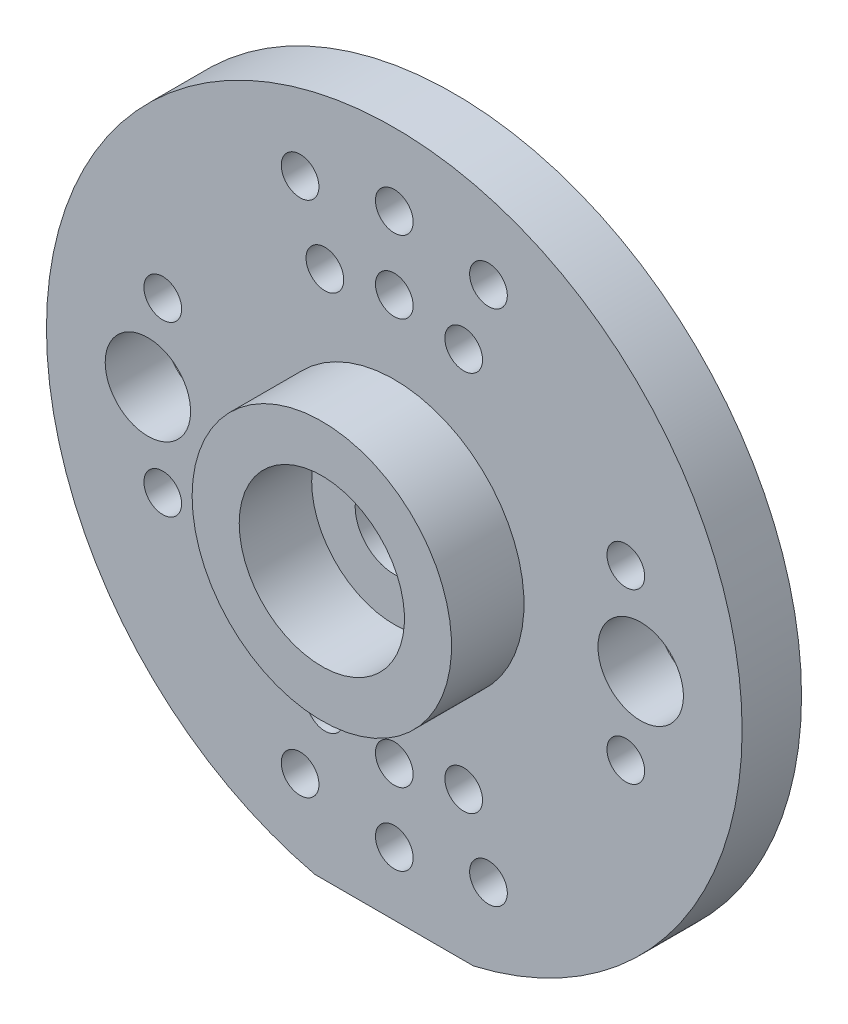
ISO-10303-21;
HEADER;
FILE_DESCRIPTION(('STEP AP214'),'2;1');
FILE_NAME('part.step','',(''),(''),'','','');
FILE_SCHEMA(('AUTOMOTIVE_DESIGN { 1 0 10303 214 1 1 1 1 }'));
ENDSEC;
DATA;
#1=APPLICATION_CONTEXT('core data for automotive mechanical design processes');
#2=APPLICATION_PROTOCOL_DEFINITION('international standard','automotive_design',2000,#1);
#3=PRODUCT_CONTEXT('',#1,'mechanical');
#4=PRODUCT('Part','Part','',(#3));
#5=PRODUCT_RELATED_PRODUCT_CATEGORY('part','',(#4));
#6=PRODUCT_DEFINITION_FORMATION('','',#4);
#7=PRODUCT_DEFINITION_CONTEXT('part definition',#1,'design');
#8=PRODUCT_DEFINITION('design','',#6,#7);
#9=PRODUCT_DEFINITION_SHAPE('','',#8);
#10=(LENGTH_UNIT() NAMED_UNIT(*) SI_UNIT(.MILLI.,.METRE.));
#11=(NAMED_UNIT(*) PLANE_ANGLE_UNIT() SI_UNIT($,.RADIAN.));
#12=(NAMED_UNIT(*) SI_UNIT($,.STERADIAN.) SOLID_ANGLE_UNIT());
#13=UNCERTAINTY_MEASURE_WITH_UNIT(LENGTH_MEASURE(1.E-05),#10,'distance_accuracy_value','');
#14=(GEOMETRIC_REPRESENTATION_CONTEXT(3) GLOBAL_UNCERTAINTY_ASSIGNED_CONTEXT((#13)) GLOBAL_UNIT_ASSIGNED_CONTEXT((#10,
#11,#12)) REPRESENTATION_CONTEXT('',''));
#15=CARTESIAN_POINT('',(0.,0.,0.));
#16=DIRECTION('',(0.,0.,1.));
#17=DIRECTION('',(1.,0.,0.));
#18=AXIS2_PLACEMENT_3D('',#15,#16,#17);
#19=CARTESIAN_POINT('',(0.,0.,2.05));
#20=DIRECTION('',(0.,0.,-1.));
#21=DIRECTION('',(-1.,0.,0.));
#22=AXIS2_PLACEMENT_3D('',#19,#20,#21);
#23=PLANE('',#22);
#24=CARTESIAN_POINT('',(0.,0.,2.05));
#25=DIRECTION('',(0.,0.,-1.));
#26=DIRECTION('',(-1.,0.,0.));
#27=AXIS2_PLACEMENT_3D('',#24,#25,#26);
#28=CIRCLE('',#27,1.35);
#29=CARTESIAN_POINT('',(-1.35,0.,2.05));
#30=VERTEX_POINT('',#29);
#31=EDGE_CURVE('E19',#30,#30,#28,.T.);
#32=ORIENTED_EDGE('',*,*,#31,.T.);
#33=EDGE_LOOP('',(#32));
#34=FACE_BOUND('',#33,.T.);
#35=CARTESIAN_POINT('',(0.,0.,2.05));
#36=DIRECTION('',(0.,0.,-1.));
#37=DIRECTION('',(-1.,0.,0.));
#38=AXIS2_PLACEMENT_3D('',#35,#36,#37);
#39=CIRCLE('',#38,2.85);
#40=CARTESIAN_POINT('',(-2.85,0.,2.05));
#41=VERTEX_POINT('',#40);
#42=EDGE_CURVE('E190',#41,#41,#39,.F.);
#43=ORIENTED_EDGE('',*,*,#42,.T.);
#44=EDGE_LOOP('',(#43));
#45=FACE_BOUND('',#44,.T.);
#46=ADVANCED_FACE('F16',(#34,#45),#23,.F.);
#47=CARTESIAN_POINT('',(0.,0.,0.));
#48=DIRECTION('',(0.,0.,-1.));
#49=DIRECTION('',(-1.,0.,0.));
#50=AXIS2_PLACEMENT_3D('',#47,#48,#49);
#51=CYLINDRICAL_SURFACE('',#50,1.35);
#52=CARTESIAN_POINT('',(0.,0.,0.));
#53=DIRECTION('',(0.,0.,-1.));
#54=DIRECTION('',(-1.,0.,0.));
#55=AXIS2_PLACEMENT_3D('',#52,#53,#54);
#56=CIRCLE('',#55,1.35);
#57=CARTESIAN_POINT('',(-1.35,0.,0.));
#58=VERTEX_POINT('',#57);
#59=EDGE_CURVE('E188',#58,#58,#56,.F.);
#60=ORIENTED_EDGE('',*,*,#59,.F.);
#61=EDGE_LOOP('',(#60));
#62=FACE_BOUND('',#61,.T.);
#63=ORIENTED_EDGE('',*,*,#31,.F.);
#64=EDGE_LOOP('',(#63));
#65=FACE_BOUND('',#64,.T.);
#66=ADVANCED_FACE('F198',(#62,#65),#51,.F.);
#67=CARTESIAN_POINT('',(0.,0.,2.05));
#68=DIRECTION('',(0.,0.,-1.));
#69=DIRECTION('',(-1.,0.,0.));
#70=AXIS2_PLACEMENT_3D('',#67,#68,#69);
#71=CYLINDRICAL_SURFACE('',#70,2.85);
#72=CARTESIAN_POINT('',(0.,0.,4.55));
#73=DIRECTION('',(0.,0.,-1.));
#74=DIRECTION('',(-1.,0.,0.));
#75=AXIS2_PLACEMENT_3D('',#72,#73,#74);
#76=CIRCLE('',#75,2.85);
#77=CARTESIAN_POINT('',(-2.85,0.,4.55));
#78=VERTEX_POINT('',#77);
#79=EDGE_CURVE('E185',#78,#78,#76,.F.);
#80=ORIENTED_EDGE('',*,*,#79,.T.);
#81=EDGE_LOOP('',(#80));
#82=FACE_BOUND('',#81,.T.);
#83=ORIENTED_EDGE('',*,*,#42,.F.);
#84=EDGE_LOOP('',(#83));
#85=FACE_BOUND('',#84,.T.);
#86=ADVANCED_FACE('F200',(#82,#85),#71,.F.);
#87=CARTESIAN_POINT('',(0.,0.,0.));
#88=DIRECTION('',(0.,0.,-1.));
#89=DIRECTION('',(-1.,0.,0.));
#90=AXIS2_PLACEMENT_3D('',#87,#88,#89);
#91=PLANE('',#90);
#92=ORIENTED_EDGE('',*,*,#59,.T.);
#93=EDGE_LOOP('',(#92));
#94=FACE_BOUND('',#93,.T.);
#95=CARTESIAN_POINT('',(0.,0.,0.));
#96=DIRECTION('',(0.,0.,1.));
#97=DIRECTION('',(1.,0.,0.));
#98=AXIS2_PLACEMENT_3D('',#95,#96,#97);
#99=CIRCLE('',#98,3.);
#100=CARTESIAN_POINT('',(3.,0.,0.));
#101=VERTEX_POINT('',#100);
#102=EDGE_CURVE('E182',#101,#101,#99,.F.);
#103=ORIENTED_EDGE('',*,*,#102,.T.);
#104=EDGE_LOOP('',(#103));
#105=FACE_BOUND('',#104,.T.);
#106=ADVANCED_FACE('F207',(#94,#105),#91,.T.);
#107=CARTESIAN_POINT('',(0.,0.,4.55));
#108=DIRECTION('',(0.,0.,-1.));
#109=DIRECTION('',(-1.,0.,0.));
#110=AXIS2_PLACEMENT_3D('',#107,#108,#109);
#111=PLANE('',#110);
#112=ORIENTED_EDGE('',*,*,#79,.F.);
#113=EDGE_LOOP('',(#112));
#114=FACE_BOUND('',#113,.T.);
#115=CARTESIAN_POINT('',(0.,0.,4.55));
#116=DIRECTION('',(0.,0.,-1.));
#117=DIRECTION('',(-1.,0.,0.));
#118=AXIS2_PLACEMENT_3D('',#115,#116,#117);
#119=CIRCLE('',#118,4.475);
#120=CARTESIAN_POINT('',(-4.475,0.,4.55));
#121=VERTEX_POINT('',#120);
#122=EDGE_CURVE('E179',#121,#121,#119,.T.);
#123=ORIENTED_EDGE('',*,*,#122,.F.);
#124=EDGE_LOOP('',(#123));
#125=FACE_BOUND('',#124,.T.);
#126=ADVANCED_FACE('F312',(#114,#125),#111,.F.);
#127=CARTESIAN_POINT('',(0.,0.,0.));
#128=DIRECTION('',(0.,0.,1.));
#129=DIRECTION('',(1.,0.,0.));
#130=AXIS2_PLACEMENT_3D('',#127,#128,#129);
#131=CYLINDRICAL_SURFACE('',#130,3.);
#132=CARTESIAN_POINT('',(0.,0.,-0.5));
#133=DIRECTION('',(0.,0.,1.));
#134=DIRECTION('',(1.,0.,0.));
#135=AXIS2_PLACEMENT_3D('',#132,#133,#134);
#136=CIRCLE('',#135,3.);
#137=CARTESIAN_POINT('',(3.,0.,-0.5));
#138=VERTEX_POINT('',#137);
#139=EDGE_CURVE('E176',#138,#138,#136,.F.);
#140=ORIENTED_EDGE('',*,*,#139,.T.);
#141=EDGE_LOOP('',(#140));
#142=FACE_BOUND('',#141,.T.);
#143=ORIENTED_EDGE('',*,*,#102,.F.);
#144=EDGE_LOOP('',(#143));
#145=FACE_BOUND('',#144,.T.);
#146=ADVANCED_FACE('F308',(#142,#145),#131,.F.);
#147=CARTESIAN_POINT('',(0.,0.,2.05));
#148=DIRECTION('',(0.,0.,-1.));
#149=DIRECTION('',(-1.,0.,0.));
#150=AXIS2_PLACEMENT_3D('',#147,#148,#149);
#151=CYLINDRICAL_SURFACE('',#150,4.475);
#152=CARTESIAN_POINT('',(0.,0.,2.05));
#153=DIRECTION('',(0.,0.,-1.));
#154=DIRECTION('',(-1.,0.,0.));
#155=AXIS2_PLACEMENT_3D('',#152,#153,#154);
#156=CIRCLE('',#155,4.475);
#157=CARTESIAN_POINT('',(-4.475,0.,2.05));
#158=VERTEX_POINT('',#157);
#159=EDGE_CURVE('E173',#158,#158,#156,.F.);
#160=ORIENTED_EDGE('',*,*,#159,.T.);
#161=EDGE_LOOP('',(#160));
#162=FACE_BOUND('',#161,.T.);
#163=ORIENTED_EDGE('',*,*,#122,.T.);
#164=EDGE_LOOP('',(#163));
#165=FACE_BOUND('',#164,.T.);
#166=ADVANCED_FACE('F304',(#162,#165),#151,.T.);
#167=CARTESIAN_POINT('',(0.,0.,-0.5));
#168=DIRECTION('',(0.,0.,1.));
#169=DIRECTION('',(1.,0.,0.));
#170=AXIS2_PLACEMENT_3D('',#167,#168,#169);
#171=PLANE('',#170);
#172=ORIENTED_EDGE('',*,*,#139,.F.);
#173=EDGE_LOOP('',(#172));
#174=FACE_BOUND('',#173,.T.);
#175=CARTESIAN_POINT('',(0.,0.,-0.5));
#176=DIRECTION('',(0.,0.,1.));
#177=DIRECTION('',(1.,0.,0.));
#178=AXIS2_PLACEMENT_3D('',#175,#176,#177);
#179=CIRCLE('',#178,3.75);
#180=CARTESIAN_POINT('',(3.75,0.,-0.5));
#181=VERTEX_POINT('',#180);
#182=EDGE_CURVE('E167',#181,#181,#179,.T.);
#183=ORIENTED_EDGE('',*,*,#182,.F.);
#184=EDGE_LOOP('',(#183));
#185=FACE_BOUND('',#184,.T.);
#186=ADVANCED_FACE('F301',(#174,#185),#171,.F.);
#187=CARTESIAN_POINT('',(0.,0.,2.05));
#188=DIRECTION('',(0.,0.,-1.));
#189=DIRECTION('',(-1.,0.,0.));
#190=AXIS2_PLACEMENT_3D('',#187,#188,#189);
#191=PLANE('',#190);
#192=DIRECTION('',(1.,0.,0.));
#193=VECTOR('',#192,1.);
#194=CARTESIAN_POINT('',(-6.35,-11.684,2.05));
#195=LINE('',#194,#193);
#196=CARTESIAN_POINT('',(2.73571635956655,-11.684,2.05));
#197=VERTEX_POINT('',#196);
#198=CARTESIAN_POINT('',(-2.73571635956654,-11.684,2.05));
#199=VERTEX_POINT('',#198);
#200=EDGE_CURVE('E50',#197,#199,#195,.F.);
#201=ORIENTED_EDGE('',*,*,#200,.F.);
#202=CARTESIAN_POINT('',(0.,0.,2.05));
#203=DIRECTION('',(0.,0.,-1.));
#204=DIRECTION('',(-1.,0.,0.));
#205=AXIS2_PLACEMENT_3D('',#202,#203,#204);
#206=CIRCLE('',#205,12.);
#207=EDGE_CURVE('E41',#199,#197,#206,.T.);
#208=ORIENTED_EDGE('',*,*,#207,.F.);
#209=EDGE_LOOP('',(#201,#208));
#210=FACE_BOUND('',#209,.T.);
#211=CARTESIAN_POINT('',(8.5,0.,2.05));
#212=DIRECTION('',(0.,0.,-1.));
#213=DIRECTION('',(-1.,0.,0.));
#214=AXIS2_PLACEMENT_3D('',#211,#212,#213);
#215=CIRCLE('',#214,1.4732);
#216=CARTESIAN_POINT('',(7.0268,0.,2.05));
#217=VERTEX_POINT('',#216);
#218=EDGE_CURVE('E54',#217,#217,#215,.T.);
#219=ORIENTED_EDGE('',*,*,#218,.T.);
#220=EDGE_LOOP('',(#219));
#221=FACE_BOUND('',#220,.T.);
#222=CARTESIAN_POINT('',(-7.98738727668022,2.90717121826819,2.05));
#223=DIRECTION('',(0.,0.,-1.));
#224=DIRECTION('',(-1.,0.,0.));
#225=AXIS2_PLACEMENT_3D('',#222,#223,#224);
#226=CIRCLE('',#225,0.65);
#227=CARTESIAN_POINT('',(-8.63738727668022,2.90717121826819,2.05));
#228=VERTEX_POINT('',#227);
#229=EDGE_CURVE('E119',#228,#228,#226,.T.);
#230=ORIENTED_EDGE('',*,*,#229,.T.);
#231=EDGE_LOOP('',(#230));
#232=FACE_BOUND('',#231,.T.);
#233=CARTESIAN_POINT('',(-7.98738727668022,-2.90717121826819,2.05));
#234=DIRECTION('',(0.,0.,-1.));
#235=DIRECTION('',(-1.,0.,0.));
#236=AXIS2_PLACEMENT_3D('',#233,#234,#235);
#237=CIRCLE('',#236,0.65);
#238=CARTESIAN_POINT('',(-8.63738727668022,-2.90717121826819,2.05));
#239=VERTEX_POINT('',#238);
#240=EDGE_CURVE('E122',#239,#239,#237,.T.);
#241=ORIENTED_EDGE('',*,*,#240,.T.);
#242=EDGE_LOOP('',(#241));
#243=FACE_BOUND('',#242,.T.);
#244=CARTESIAN_POINT('',(7.98738727668022,2.90717121826819,2.05));
#245=DIRECTION('',(0.,0.,-1.));
#246=DIRECTION('',(-1.,0.,0.));
#247=AXIS2_PLACEMENT_3D('',#244,#245,#246);
#248=CIRCLE('',#247,0.65);
#249=CARTESIAN_POINT('',(7.33738727668022,2.90717121826819,2.05));
#250=VERTEX_POINT('',#249);
#251=EDGE_CURVE('E125',#250,#250,#248,.T.);
#252=ORIENTED_EDGE('',*,*,#251,.T.);
#253=EDGE_LOOP('',(#252));
#254=FACE_BOUND('',#253,.T.);
#255=CARTESIAN_POINT('',(7.98738727668022,-2.90717121826819,2.05));
#256=DIRECTION('',(0.,0.,-1.));
#257=DIRECTION('',(-1.,0.,0.));
#258=AXIS2_PLACEMENT_3D('',#255,#256,#257);
#259=CIRCLE('',#258,0.65);
#260=CARTESIAN_POINT('',(7.33738727668022,-2.90717121826819,2.05));
#261=VERTEX_POINT('',#260);
#262=EDGE_CURVE('E128',#261,#261,#259,.T.);
#263=ORIENTED_EDGE('',*,*,#262,.T.);
#264=EDGE_LOOP('',(#263));
#265=FACE_BOUND('',#264,.T.);
#266=CARTESIAN_POINT('',(2.39414100327968,-6.57784834550136,2.05));
#267=DIRECTION('',(0.,0.,-1.));
#268=DIRECTION('',(-1.,0.,0.));
#269=AXIS2_PLACEMENT_3D('',#266,#267,#268);
#270=CIRCLE('',#269,0.65);
#271=CARTESIAN_POINT('',(1.74414100327968,-6.57784834550136,2.05));
#272=VERTEX_POINT('',#271);
#273=EDGE_CURVE('E131',#272,#272,#270,.T.);
#274=ORIENTED_EDGE('',*,*,#273,.T.);
#275=EDGE_LOOP('',(#274));
#276=FACE_BOUND('',#275,.T.);
#277=CARTESIAN_POINT('',(3.24919136159386,-8.92707989746613,2.05));
#278=DIRECTION('',(0.,0.,-1.));
#279=DIRECTION('',(-1.,0.,0.));
#280=AXIS2_PLACEMENT_3D('',#277,#278,#279);
#281=CIRCLE('',#280,0.65);
#282=CARTESIAN_POINT('',(2.59919136159386,-8.92707989746613,2.05));
#283=VERTEX_POINT('',#282);
#284=EDGE_CURVE('E134',#283,#283,#281,.T.);
#285=ORIENTED_EDGE('',*,*,#284,.T.);
#286=EDGE_LOOP('',(#285));
#287=FACE_BOUND('',#286,.T.);
#288=CARTESIAN_POINT('',(-2.39414100327968,-6.57784834550136,2.05));
#289=DIRECTION('',(0.,0.,-1.));
#290=DIRECTION('',(0.,1.,0.));
#291=AXIS2_PLACEMENT_3D('',#288,#289,#290);
#292=CIRCLE('',#291,0.65);
#293=CARTESIAN_POINT('',(-2.39414100327968,-5.92784834550136,2.05));
#294=VERTEX_POINT('',#293);
#295=EDGE_CURVE('E137',#294,#294,#292,.T.);
#296=ORIENTED_EDGE('',*,*,#295,.T.);
#297=EDGE_LOOP('',(#296));
#298=FACE_BOUND('',#297,.T.);
#299=CARTESIAN_POINT('',(-3.24919136159386,-8.92707989746613,2.05));
#300=DIRECTION('',(0.,0.,-1.));
#301=DIRECTION('',(0.,1.,0.));
#302=AXIS2_PLACEMENT_3D('',#299,#300,#301);
#303=CIRCLE('',#302,0.65);
#304=CARTESIAN_POINT('',(-3.24919136159386,-8.27707989746613,2.05));
#305=VERTEX_POINT('',#304);
#306=EDGE_CURVE('E140',#305,#305,#303,.T.);
#307=ORIENTED_EDGE('',*,*,#306,.T.);
#308=EDGE_LOOP('',(#307));
#309=FACE_BOUND('',#308,.T.);
#310=CARTESIAN_POINT('',(0.,-7.,2.05));
#311=DIRECTION('',(0.,0.,-1.));
#312=DIRECTION('',(-1.,0.,0.));
#313=AXIS2_PLACEMENT_3D('',#310,#311,#312);
#314=CIRCLE('',#313,0.65);
#315=CARTESIAN_POINT('',(-0.649999999999999,-7.,2.05));
#316=VERTEX_POINT('',#315);
#317=EDGE_CURVE('E143',#316,#316,#314,.T.);
#318=ORIENTED_EDGE('',*,*,#317,.T.);
#319=EDGE_LOOP('',(#318));
#320=FACE_BOUND('',#319,.T.);
#321=CARTESIAN_POINT('',(0.,-9.5,2.05));
#322=DIRECTION('',(0.,0.,-1.));
#323=DIRECTION('',(-1.,0.,0.));
#324=AXIS2_PLACEMENT_3D('',#321,#322,#323);
#325=CIRCLE('',#324,0.65);
#326=CARTESIAN_POINT('',(-0.649999999999999,-9.5,2.05));
#327=VERTEX_POINT('',#326);
#328=EDGE_CURVE('E146',#327,#327,#325,.T.);
#329=ORIENTED_EDGE('',*,*,#328,.T.);
#330=EDGE_LOOP('',(#329));
#331=FACE_BOUND('',#330,.T.);
#332=CARTESIAN_POINT('',(-2.39414100327968,6.57784834550136,2.05));
#333=DIRECTION('',(0.,0.,-1.));
#334=DIRECTION('',(-1.,0.,0.));
#335=AXIS2_PLACEMENT_3D('',#332,#333,#334);
#336=CIRCLE('',#335,0.65);
#337=CARTESIAN_POINT('',(-3.04414100327968,6.57784834550136,2.05));
#338=VERTEX_POINT('',#337);
#339=EDGE_CURVE('E149',#338,#338,#336,.T.);
#340=ORIENTED_EDGE('',*,*,#339,.T.);
#341=EDGE_LOOP('',(#340));
#342=FACE_BOUND('',#341,.T.);
#343=CARTESIAN_POINT('',(-3.24919136159385,8.92707989746613,2.05));
#344=DIRECTION('',(0.,0.,-1.));
#345=DIRECTION('',(-1.,0.,0.));
#346=AXIS2_PLACEMENT_3D('',#343,#344,#345);
#347=CIRCLE('',#346,0.65);
#348=CARTESIAN_POINT('',(-3.89919136159385,8.92707989746613,2.05));
#349=VERTEX_POINT('',#348);
#350=EDGE_CURVE('E152',#349,#349,#347,.T.);
#351=ORIENTED_EDGE('',*,*,#350,.T.);
#352=EDGE_LOOP('',(#351));
#353=FACE_BOUND('',#352,.T.);
#354=CARTESIAN_POINT('',(2.39414100327968,6.57784834550136,2.05));
#355=DIRECTION('',(0.,0.,-1.));
#356=DIRECTION('',(-1.,0.,0.));
#357=AXIS2_PLACEMENT_3D('',#354,#355,#356);
#358=CIRCLE('',#357,0.65);
#359=CARTESIAN_POINT('',(1.74414100327968,6.57784834550136,2.05));
#360=VERTEX_POINT('',#359);
#361=EDGE_CURVE('E155',#360,#360,#358,.T.);
#362=ORIENTED_EDGE('',*,*,#361,.T.);
#363=EDGE_LOOP('',(#362));
#364=FACE_BOUND('',#363,.T.);
#365=CARTESIAN_POINT('',(3.24919136159386,8.92707989746613,2.05));
#366=DIRECTION('',(0.,0.,-1.));
#367=DIRECTION('',(-1.,0.,0.));
#368=AXIS2_PLACEMENT_3D('',#365,#366,#367);
#369=CIRCLE('',#368,0.65);
#370=CARTESIAN_POINT('',(2.59919136159386,8.92707989746613,2.05));
#371=VERTEX_POINT('',#370);
#372=EDGE_CURVE('E158',#371,#371,#369,.T.);
#373=ORIENTED_EDGE('',*,*,#372,.T.);
#374=EDGE_LOOP('',(#373));
#375=FACE_BOUND('',#374,.T.);
#376=CARTESIAN_POINT('',(0.,7.,2.05));
#377=DIRECTION('',(0.,0.,-1.));
#378=DIRECTION('',(-1.,0.,0.));
#379=AXIS2_PLACEMENT_3D('',#376,#377,#378);
#380=CIRCLE('',#379,0.65);
#381=CARTESIAN_POINT('',(-0.65,7.,2.05));
#382=VERTEX_POINT('',#381);
#383=EDGE_CURVE('E161',#382,#382,#380,.T.);
#384=ORIENTED_EDGE('',*,*,#383,.T.);
#385=EDGE_LOOP('',(#384));
#386=FACE_BOUND('',#385,.T.);
#387=CARTESIAN_POINT('',(0.,9.5,2.05));
#388=DIRECTION('',(0.,0.,-1.));
#389=DIRECTION('',(-1.,0.,0.));
#390=AXIS2_PLACEMENT_3D('',#387,#388,#389);
#391=CIRCLE('',#390,0.65);
#392=CARTESIAN_POINT('',(-0.65,9.5,2.05));
#393=VERTEX_POINT('',#392);
#394=EDGE_CURVE('E164',#393,#393,#391,.T.);
#395=ORIENTED_EDGE('',*,*,#394,.T.);
#396=EDGE_LOOP('',(#395));
#397=FACE_BOUND('',#396,.T.);
#398=ORIENTED_EDGE('',*,*,#159,.F.);
#399=EDGE_LOOP('',(#398));
#400=FACE_BOUND('',#399,.T.);
#401=CARTESIAN_POINT('',(-8.5,0.,2.05));
#402=DIRECTION('',(0.,0.,-1.));
#403=DIRECTION('',(-1.,0.,0.));
#404=AXIS2_PLACEMENT_3D('',#401,#402,#403);
#405=CIRCLE('',#404,1.4732);
#406=CARTESIAN_POINT('',(-9.9732,0.,2.05));
#407=VERTEX_POINT('',#406);
#408=EDGE_CURVE('E170',#407,#407,#405,.T.);
#409=ORIENTED_EDGE('',*,*,#408,.T.);
#410=EDGE_LOOP('',(#409));
#411=FACE_BOUND('',#410,.T.);
#412=ADVANCED_FACE('F51',(#210,#221,#232,#243,#254,#265,#276,#287,#298,#309,#320,#331,#342,#353,
#364,#375,#386,#397,#400,#411),#191,.F.);
#413=CARTESIAN_POINT('',(-8.5,0.,-32.2647563010434));
#414=DIRECTION('',(0.,0.,-1.));
#415=DIRECTION('',(-1.,0.,0.));
#416=AXIS2_PLACEMENT_3D('',#413,#414,#415);
#417=CYLINDRICAL_SURFACE('',#416,1.4732);
#418=CARTESIAN_POINT('',(-8.5,0.,0.));
#419=DIRECTION('',(0.,0.,-1.));
#420=DIRECTION('',(-1.,0.,0.));
#421=AXIS2_PLACEMENT_3D('',#418,#419,#420);
#422=CIRCLE('',#421,1.4732);
#423=CARTESIAN_POINT('',(-9.9732,0.,0.));
#424=VERTEX_POINT('',#423);
#425=EDGE_CURVE('E48',#424,#424,#422,.F.);
#426=ORIENTED_EDGE('',*,*,#425,.F.);
#427=EDGE_LOOP('',(#426));
#428=FACE_BOUND('',#427,.T.);
#429=ORIENTED_EDGE('',*,*,#408,.F.);
#430=EDGE_LOOP('',(#429));
#431=FACE_BOUND('',#430,.T.);
#432=ADVANCED_FACE('F294',(#428,#431),#417,.F.);
#433=CARTESIAN_POINT('',(0.,0.,0.));
#434=DIRECTION('',(0.,0.,1.));
#435=DIRECTION('',(1.,0.,0.));
#436=AXIS2_PLACEMENT_3D('',#433,#434,#435);
#437=CYLINDRICAL_SURFACE('',#436,3.75);
#438=ORIENTED_EDGE('',*,*,#182,.T.);
#439=EDGE_LOOP('',(#438));
#440=FACE_BOUND('',#439,.T.);
#441=CARTESIAN_POINT('',(0.,0.,0.));
#442=DIRECTION('',(0.,0.,1.));
#443=DIRECTION('',(1.,0.,0.));
#444=AXIS2_PLACEMENT_3D('',#441,#442,#443);
#445=CIRCLE('',#444,3.75);
#446=CARTESIAN_POINT('',(3.75,0.,0.));
#447=VERTEX_POINT('',#446);
#448=EDGE_CURVE('E112',#447,#447,#445,.T.);
#449=ORIENTED_EDGE('',*,*,#448,.F.);
#450=EDGE_LOOP('',(#449));
#451=FACE_BOUND('',#450,.T.);
#452=ADVANCED_FACE('F290',(#440,#451),#437,.T.);
#453=CARTESIAN_POINT('',(0.,9.5,0.));
#454=DIRECTION('',(0.,0.,-1.));
#455=DIRECTION('',(-1.,0.,0.));
#456=AXIS2_PLACEMENT_3D('',#453,#454,#455);
#457=CYLINDRICAL_SURFACE('',#456,0.65);
#458=CARTESIAN_POINT('',(0.,9.5,0.));
#459=DIRECTION('',(0.,0.,-1.));
#460=DIRECTION('',(-1.,0.,0.));
#461=AXIS2_PLACEMENT_3D('',#458,#459,#460);
#462=CIRCLE('',#461,0.65);
#463=CARTESIAN_POINT('',(-0.65,9.5,0.));
#464=VERTEX_POINT('',#463);
#465=EDGE_CURVE('E109',#464,#464,#462,.F.);
#466=ORIENTED_EDGE('',*,*,#465,.F.);
#467=EDGE_LOOP('',(#466));
#468=FACE_BOUND('',#467,.T.);
#469=ORIENTED_EDGE('',*,*,#394,.F.);
#470=EDGE_LOOP('',(#469));
#471=FACE_BOUND('',#470,.T.);
#472=ADVANCED_FACE('F286',(#468,#471),#457,.F.);
#473=CARTESIAN_POINT('',(0.,7.,0.));
#474=DIRECTION('',(0.,0.,-1.));
#475=DIRECTION('',(-1.,0.,0.));
#476=AXIS2_PLACEMENT_3D('',#473,#474,#475);
#477=CYLINDRICAL_SURFACE('',#476,0.65);
#478=CARTESIAN_POINT('',(0.,7.,0.));
#479=DIRECTION('',(0.,0.,-1.));
#480=DIRECTION('',(-1.,0.,0.));
#481=AXIS2_PLACEMENT_3D('',#478,#479,#480);
#482=CIRCLE('',#481,0.65);
#483=CARTESIAN_POINT('',(-0.65,7.,0.));
#484=VERTEX_POINT('',#483);
#485=EDGE_CURVE('E106',#484,#484,#482,.F.);
#486=ORIENTED_EDGE('',*,*,#485,.F.);
#487=EDGE_LOOP('',(#486));
#488=FACE_BOUND('',#487,.T.);
#489=ORIENTED_EDGE('',*,*,#383,.F.);
#490=EDGE_LOOP('',(#489));
#491=FACE_BOUND('',#490,.T.);
#492=ADVANCED_FACE('F282',(#488,#491),#477,.F.);
#493=CARTESIAN_POINT('',(3.24919136159386,8.92707989746613,0.));
#494=DIRECTION('',(0.,0.,-1.));
#495=DIRECTION('',(-1.,0.,0.));
#496=AXIS2_PLACEMENT_3D('',#493,#494,#495);
#497=CYLINDRICAL_SURFACE('',#496,0.65);
#498=CARTESIAN_POINT('',(3.24919136159386,8.92707989746613,0.));
#499=DIRECTION('',(0.,0.,-1.));
#500=DIRECTION('',(-1.,0.,0.));
#501=AXIS2_PLACEMENT_3D('',#498,#499,#500);
#502=CIRCLE('',#501,0.65);
#503=CARTESIAN_POINT('',(2.59919136159386,8.92707989746613,0.));
#504=VERTEX_POINT('',#503);
#505=EDGE_CURVE('E103',#504,#504,#502,.F.);
#506=ORIENTED_EDGE('',*,*,#505,.F.);
#507=EDGE_LOOP('',(#506));
#508=FACE_BOUND('',#507,.T.);
#509=ORIENTED_EDGE('',*,*,#372,.F.);
#510=EDGE_LOOP('',(#509));
#511=FACE_BOUND('',#510,.T.);
#512=ADVANCED_FACE('F278',(#508,#511),#497,.F.);
#513=CARTESIAN_POINT('',(2.39414100327968,6.57784834550136,0.));
#514=DIRECTION('',(0.,0.,-1.));
#515=DIRECTION('',(-1.,0.,0.));
#516=AXIS2_PLACEMENT_3D('',#513,#514,#515);
#517=CYLINDRICAL_SURFACE('',#516,0.65);
#518=CARTESIAN_POINT('',(2.39414100327968,6.57784834550136,0.));
#519=DIRECTION('',(0.,0.,-1.));
#520=DIRECTION('',(-1.,0.,0.));
#521=AXIS2_PLACEMENT_3D('',#518,#519,#520);
#522=CIRCLE('',#521,0.65);
#523=CARTESIAN_POINT('',(1.74414100327968,6.57784834550136,0.));
#524=VERTEX_POINT('',#523);
#525=EDGE_CURVE('E100',#524,#524,#522,.F.);
#526=ORIENTED_EDGE('',*,*,#525,.F.);
#527=EDGE_LOOP('',(#526));
#528=FACE_BOUND('',#527,.T.);
#529=ORIENTED_EDGE('',*,*,#361,.F.);
#530=EDGE_LOOP('',(#529));
#531=FACE_BOUND('',#530,.T.);
#532=ADVANCED_FACE('F274',(#528,#531),#517,.F.);
#533=CARTESIAN_POINT('',(-3.24919136159385,8.92707989746613,34.3147563010435));
#534=DIRECTION('',(0.,0.,-1.));
#535=DIRECTION('',(-1.,0.,0.));
#536=AXIS2_PLACEMENT_3D('',#533,#534,#535);
#537=CYLINDRICAL_SURFACE('',#536,0.65);
#538=CARTESIAN_POINT('',(-3.24919136159385,8.92707989746613,0.));
#539=DIRECTION('',(0.,0.,-1.));
#540=DIRECTION('',(-1.,0.,0.));
#541=AXIS2_PLACEMENT_3D('',#538,#539,#540);
#542=CIRCLE('',#541,0.65);
#543=CARTESIAN_POINT('',(-3.89919136159385,8.92707989746613,0.));
#544=VERTEX_POINT('',#543);
#545=EDGE_CURVE('E97',#544,#544,#542,.F.);
#546=ORIENTED_EDGE('',*,*,#545,.F.);
#547=EDGE_LOOP('',(#546));
#548=FACE_BOUND('',#547,.T.);
#549=ORIENTED_EDGE('',*,*,#350,.F.);
#550=EDGE_LOOP('',(#549));
#551=FACE_BOUND('',#550,.T.);
#552=ADVANCED_FACE('F270',(#548,#551),#537,.F.);
#553=CARTESIAN_POINT('',(-2.39414100327968,6.57784834550136,34.3147563010435));
#554=DIRECTION('',(0.,0.,-1.));
#555=DIRECTION('',(-1.,0.,0.));
#556=AXIS2_PLACEMENT_3D('',#553,#554,#555);
#557=CYLINDRICAL_SURFACE('',#556,0.65);
#558=CARTESIAN_POINT('',(-2.39414100327968,6.57784834550136,0.));
#559=DIRECTION('',(0.,0.,-1.));
#560=DIRECTION('',(-1.,0.,0.));
#561=AXIS2_PLACEMENT_3D('',#558,#559,#560);
#562=CIRCLE('',#561,0.65);
#563=CARTESIAN_POINT('',(-3.04414100327968,6.57784834550136,0.));
#564=VERTEX_POINT('',#563);
#565=EDGE_CURVE('E94',#564,#564,#562,.F.);
#566=ORIENTED_EDGE('',*,*,#565,.F.);
#567=EDGE_LOOP('',(#566));
#568=FACE_BOUND('',#567,.T.);
#569=ORIENTED_EDGE('',*,*,#339,.F.);
#570=EDGE_LOOP('',(#569));
#571=FACE_BOUND('',#570,.T.);
#572=ADVANCED_FACE('F266',(#568,#571),#557,.F.);
#573=CARTESIAN_POINT('',(0.,-9.5,0.));
#574=DIRECTION('',(0.,0.,-1.));
#575=DIRECTION('',(-1.,0.,0.));
#576=AXIS2_PLACEMENT_3D('',#573,#574,#575);
#577=CYLINDRICAL_SURFACE('',#576,0.65);
#578=CARTESIAN_POINT('',(0.,-9.5,0.));
#579=DIRECTION('',(0.,0.,-1.));
#580=DIRECTION('',(-1.,0.,0.));
#581=AXIS2_PLACEMENT_3D('',#578,#579,#580);
#582=CIRCLE('',#581,0.65);
#583=CARTESIAN_POINT('',(-0.649999999999999,-9.5,0.));
#584=VERTEX_POINT('',#583);
#585=EDGE_CURVE('E91',#584,#584,#582,.F.);
#586=ORIENTED_EDGE('',*,*,#585,.F.);
#587=EDGE_LOOP('',(#586));
#588=FACE_BOUND('',#587,.T.);
#589=ORIENTED_EDGE('',*,*,#328,.F.);
#590=EDGE_LOOP('',(#589));
#591=FACE_BOUND('',#590,.T.);
#592=ADVANCED_FACE('F262',(#588,#591),#577,.F.);
#593=CARTESIAN_POINT('',(0.,-7.,0.));
#594=DIRECTION('',(0.,0.,-1.));
#595=DIRECTION('',(-1.,0.,0.));
#596=AXIS2_PLACEMENT_3D('',#593,#594,#595);
#597=CYLINDRICAL_SURFACE('',#596,0.65);
#598=CARTESIAN_POINT('',(0.,-7.,0.));
#599=DIRECTION('',(0.,0.,-1.));
#600=DIRECTION('',(-1.,0.,0.));
#601=AXIS2_PLACEMENT_3D('',#598,#599,#600);
#602=CIRCLE('',#601,0.65);
#603=CARTESIAN_POINT('',(-0.649999999999999,-7.,0.));
#604=VERTEX_POINT('',#603);
#605=EDGE_CURVE('E88',#604,#604,#602,.F.);
#606=ORIENTED_EDGE('',*,*,#605,.F.);
#607=EDGE_LOOP('',(#606));
#608=FACE_BOUND('',#607,.T.);
#609=ORIENTED_EDGE('',*,*,#317,.F.);
#610=EDGE_LOOP('',(#609));
#611=FACE_BOUND('',#610,.T.);
#612=ADVANCED_FACE('F258',(#608,#611),#597,.F.);
#613=CARTESIAN_POINT('',(-3.24919136159386,-8.92707989746613,0.));
#614=DIRECTION('',(0.,0.,-1.));
#615=DIRECTION('',(0.,1.,0.));
#616=AXIS2_PLACEMENT_3D('',#613,#614,#615);
#617=CYLINDRICAL_SURFACE('',#616,0.65);
#618=CARTESIAN_POINT('',(-3.24919136159385,-8.92707989746613,0.));
#619=DIRECTION('',(0.,0.,-1.));
#620=DIRECTION('',(0.,1.,0.));
#621=AXIS2_PLACEMENT_3D('',#618,#619,#620);
#622=CIRCLE('',#621,0.65);
#623=CARTESIAN_POINT('',(-3.24919136159385,-8.27707989746613,0.));
#624=VERTEX_POINT('',#623);
#625=EDGE_CURVE('E85',#624,#624,#622,.F.);
#626=ORIENTED_EDGE('',*,*,#625,.F.);
#627=EDGE_LOOP('',(#626));
#628=FACE_BOUND('',#627,.T.);
#629=ORIENTED_EDGE('',*,*,#306,.F.);
#630=EDGE_LOOP('',(#629));
#631=FACE_BOUND('',#630,.T.);
#632=ADVANCED_FACE('F254',(#628,#631),#617,.F.);
#633=CARTESIAN_POINT('',(-2.39414100327968,-6.57784834550136,0.));
#634=DIRECTION('',(0.,0.,-1.));
#635=DIRECTION('',(0.,1.,0.));
#636=AXIS2_PLACEMENT_3D('',#633,#634,#635);
#637=CYLINDRICAL_SURFACE('',#636,0.65);
#638=CARTESIAN_POINT('',(-2.39414100327968,-6.57784834550136,0.));
#639=DIRECTION('',(0.,0.,-1.));
#640=DIRECTION('',(0.,1.,0.));
#641=AXIS2_PLACEMENT_3D('',#638,#639,#640);
#642=CIRCLE('',#641,0.65);
#643=CARTESIAN_POINT('',(-2.39414100327968,-5.92784834550136,0.));
#644=VERTEX_POINT('',#643);
#645=EDGE_CURVE('E82',#644,#644,#642,.F.);
#646=ORIENTED_EDGE('',*,*,#645,.F.);
#647=EDGE_LOOP('',(#646));
#648=FACE_BOUND('',#647,.T.);
#649=ORIENTED_EDGE('',*,*,#295,.F.);
#650=EDGE_LOOP('',(#649));
#651=FACE_BOUND('',#650,.T.);
#652=ADVANCED_FACE('F250',(#648,#651),#637,.F.);
#653=CARTESIAN_POINT('',(3.24919136159386,-8.92707989746613,34.3147563010435));
#654=DIRECTION('',(0.,0.,-1.));
#655=DIRECTION('',(-1.,0.,0.));
#656=AXIS2_PLACEMENT_3D('',#653,#654,#655);
#657=CYLINDRICAL_SURFACE('',#656,0.65);
#658=CARTESIAN_POINT('',(3.24919136159386,-8.92707989746613,0.));
#659=DIRECTION('',(0.,0.,-1.));
#660=DIRECTION('',(-1.,0.,0.));
#661=AXIS2_PLACEMENT_3D('',#658,#659,#660);
#662=CIRCLE('',#661,0.65);
#663=CARTESIAN_POINT('',(2.59919136159386,-8.92707989746613,0.));
#664=VERTEX_POINT('',#663);
#665=EDGE_CURVE('E79',#664,#664,#662,.F.);
#666=ORIENTED_EDGE('',*,*,#665,.F.);
#667=EDGE_LOOP('',(#666));
#668=FACE_BOUND('',#667,.T.);
#669=ORIENTED_EDGE('',*,*,#284,.F.);
#670=EDGE_LOOP('',(#669));
#671=FACE_BOUND('',#670,.T.);
#672=ADVANCED_FACE('F246',(#668,#671),#657,.F.);
#673=CARTESIAN_POINT('',(2.39414100327968,-6.57784834550136,34.3147563010435));
#674=DIRECTION('',(0.,0.,-1.));
#675=DIRECTION('',(-1.,0.,0.));
#676=AXIS2_PLACEMENT_3D('',#673,#674,#675);
#677=CYLINDRICAL_SURFACE('',#676,0.65);
#678=CARTESIAN_POINT('',(2.39414100327968,-6.57784834550136,0.));
#679=DIRECTION('',(0.,0.,-1.));
#680=DIRECTION('',(-1.,0.,0.));
#681=AXIS2_PLACEMENT_3D('',#678,#679,#680);
#682=CIRCLE('',#681,0.65);
#683=CARTESIAN_POINT('',(1.74414100327968,-6.57784834550136,0.));
#684=VERTEX_POINT('',#683);
#685=EDGE_CURVE('E76',#684,#684,#682,.F.);
#686=ORIENTED_EDGE('',*,*,#685,.F.);
#687=EDGE_LOOP('',(#686));
#688=FACE_BOUND('',#687,.T.);
#689=ORIENTED_EDGE('',*,*,#273,.F.);
#690=EDGE_LOOP('',(#689));
#691=FACE_BOUND('',#690,.T.);
#692=ADVANCED_FACE('F242',(#688,#691),#677,.F.);
#693=CARTESIAN_POINT('',(7.98738727668022,-2.90717121826819,0.));
#694=DIRECTION('',(0.,0.,-1.));
#695=DIRECTION('',(-1.,0.,0.));
#696=AXIS2_PLACEMENT_3D('',#693,#694,#695);
#697=CYLINDRICAL_SURFACE('',#696,0.65);
#698=CARTESIAN_POINT('',(7.98738727668022,-2.90717121826819,0.));
#699=DIRECTION('',(0.,0.,-1.));
#700=DIRECTION('',(-1.,0.,0.));
#701=AXIS2_PLACEMENT_3D('',#698,#699,#700);
#702=CIRCLE('',#701,0.65);
#703=CARTESIAN_POINT('',(7.33738727668022,-2.90717121826819,0.));
#704=VERTEX_POINT('',#703);
#705=EDGE_CURVE('E73',#704,#704,#702,.F.);
#706=ORIENTED_EDGE('',*,*,#705,.F.);
#707=EDGE_LOOP('',(#706));
#708=FACE_BOUND('',#707,.T.);
#709=ORIENTED_EDGE('',*,*,#262,.F.);
#710=EDGE_LOOP('',(#709));
#711=FACE_BOUND('',#710,.T.);
#712=ADVANCED_FACE('F238',(#708,#711),#697,.F.);
#713=CARTESIAN_POINT('',(7.98738727668022,2.90717121826819,34.3147563010435));
#714=DIRECTION('',(0.,0.,-1.));
#715=DIRECTION('',(-1.,0.,0.));
#716=AXIS2_PLACEMENT_3D('',#713,#714,#715);
#717=CYLINDRICAL_SURFACE('',#716,0.65);
#718=CARTESIAN_POINT('',(7.98738727668022,2.90717121826819,0.));
#719=DIRECTION('',(0.,0.,-1.));
#720=DIRECTION('',(-1.,0.,0.));
#721=AXIS2_PLACEMENT_3D('',#718,#719,#720);
#722=CIRCLE('',#721,0.65);
#723=CARTESIAN_POINT('',(7.33738727668022,2.90717121826819,0.));
#724=VERTEX_POINT('',#723);
#725=EDGE_CURVE('E70',#724,#724,#722,.F.);
#726=ORIENTED_EDGE('',*,*,#725,.F.);
#727=EDGE_LOOP('',(#726));
#728=FACE_BOUND('',#727,.T.);
#729=ORIENTED_EDGE('',*,*,#251,.F.);
#730=EDGE_LOOP('',(#729));
#731=FACE_BOUND('',#730,.T.);
#732=ADVANCED_FACE('F234',(#728,#731),#717,.F.);
#733=CARTESIAN_POINT('',(-7.98738727668022,-2.90717121826819,34.3147563010435));
#734=DIRECTION('',(0.,0.,-1.));
#735=DIRECTION('',(-1.,0.,0.));
#736=AXIS2_PLACEMENT_3D('',#733,#734,#735);
#737=CYLINDRICAL_SURFACE('',#736,0.65);
#738=CARTESIAN_POINT('',(-7.98738727668022,-2.90717121826819,0.));
#739=DIRECTION('',(0.,0.,-1.));
#740=DIRECTION('',(-1.,0.,0.));
#741=AXIS2_PLACEMENT_3D('',#738,#739,#740);
#742=CIRCLE('',#741,0.65);
#743=CARTESIAN_POINT('',(-8.63738727668022,-2.90717121826819,0.));
#744=VERTEX_POINT('',#743);
#745=EDGE_CURVE('E67',#744,#744,#742,.F.);
#746=ORIENTED_EDGE('',*,*,#745,.F.);
#747=EDGE_LOOP('',(#746));
#748=FACE_BOUND('',#747,.T.);
#749=ORIENTED_EDGE('',*,*,#240,.F.);
#750=EDGE_LOOP('',(#749));
#751=FACE_BOUND('',#750,.T.);
#752=ADVANCED_FACE('F230',(#748,#751),#737,.F.);
#753=CARTESIAN_POINT('',(-7.98738727668022,2.90717121826819,0.));
#754=DIRECTION('',(0.,0.,-1.));
#755=DIRECTION('',(-1.,0.,0.));
#756=AXIS2_PLACEMENT_3D('',#753,#754,#755);
#757=CYLINDRICAL_SURFACE('',#756,0.65);
#758=CARTESIAN_POINT('',(-7.98738727668022,2.90717121826819,0.));
#759=DIRECTION('',(0.,0.,-1.));
#760=DIRECTION('',(-1.,0.,0.));
#761=AXIS2_PLACEMENT_3D('',#758,#759,#760);
#762=CIRCLE('',#761,0.65);
#763=CARTESIAN_POINT('',(-8.63738727668022,2.90717121826819,0.));
#764=VERTEX_POINT('',#763);
#765=EDGE_CURVE('E64',#764,#764,#762,.F.);
#766=ORIENTED_EDGE('',*,*,#765,.F.);
#767=EDGE_LOOP('',(#766));
#768=FACE_BOUND('',#767,.T.);
#769=ORIENTED_EDGE('',*,*,#229,.F.);
#770=EDGE_LOOP('',(#769));
#771=FACE_BOUND('',#770,.T.);
#772=ADVANCED_FACE('F226',(#768,#771),#757,.F.);
#773=CARTESIAN_POINT('',(8.5,0.,-32.2647563010434));
#774=DIRECTION('',(0.,0.,-1.));
#775=DIRECTION('',(-1.,0.,0.));
#776=AXIS2_PLACEMENT_3D('',#773,#774,#775);
#777=CYLINDRICAL_SURFACE('',#776,1.4732);
#778=CARTESIAN_POINT('',(8.5,0.,0.));
#779=DIRECTION('',(0.,0.,-1.));
#780=DIRECTION('',(-1.,0.,0.));
#781=AXIS2_PLACEMENT_3D('',#778,#779,#780);
#782=CIRCLE('',#781,1.4732);
#783=CARTESIAN_POINT('',(7.0268,0.,0.));
#784=VERTEX_POINT('',#783);
#785=EDGE_CURVE('E61',#784,#784,#782,.F.);
#786=ORIENTED_EDGE('',*,*,#785,.F.);
#787=EDGE_LOOP('',(#786));
#788=FACE_BOUND('',#787,.T.);
#789=ORIENTED_EDGE('',*,*,#218,.F.);
#790=EDGE_LOOP('',(#789));
#791=FACE_BOUND('',#790,.T.);
#792=ADVANCED_FACE('F223',(#788,#791),#777,.F.);
#793=CARTESIAN_POINT('',(-6.35,-11.684,-35.7503994158792));
#794=DIRECTION('',(0.,-1.,0.));
#795=DIRECTION('',(1.,0.,0.));
#796=AXIS2_PLACEMENT_3D('',#793,#794,#795);
#797=PLANE('',#796);
#798=DIRECTION('',(-1.,0.,0.));
#799=VECTOR('',#798,1.);
#800=CARTESIAN_POINT('',(0.,-11.684,0.));
#801=LINE('',#800,#799);
#802=CARTESIAN_POINT('',(2.73571635956655,-11.684,0.));
#803=VERTEX_POINT('',#802);
#804=CARTESIAN_POINT('',(-2.73571635956654,-11.684,0.));
#805=VERTEX_POINT('',#804);
#806=EDGE_CURVE('E11',#803,#805,#801,.T.);
#807=ORIENTED_EDGE('',*,*,#806,.F.);
#808=DIRECTION('',(0.,0.,1.));
#809=VECTOR('',#808,1.);
#810=CARTESIAN_POINT('',(2.73571635956655,-11.684,-35.7503994158792));
#811=LINE('',#810,#809);
#812=EDGE_CURVE('E45',#803,#197,#811,.T.);
#813=ORIENTED_EDGE('',*,*,#812,.T.);
#814=ORIENTED_EDGE('',*,*,#200,.T.);
#815=DIRECTION('',(0.,0.,-1.));
#816=VECTOR('',#815,1.);
#817=CARTESIAN_POINT('',(-2.73571635956654,-11.684,0.));
#818=LINE('',#817,#816);
#819=EDGE_CURVE('E47',#805,#199,#818,.F.);
#820=ORIENTED_EDGE('',*,*,#819,.F.);
#821=EDGE_LOOP('',(#807,#813,#814,#820));
#822=FACE_BOUND('',#821,.T.);
#823=ADVANCED_FACE('F56',(#822),#797,.T.);
#824=CARTESIAN_POINT('',(0.,0.,0.));
#825=DIRECTION('',(0.,0.,-1.));
#826=DIRECTION('',(-1.,0.,0.));
#827=AXIS2_PLACEMENT_3D('',#824,#825,#826);
#828=CYLINDRICAL_SURFACE('',#827,12.);
#829=ORIENTED_EDGE('',*,*,#207,.T.);
#830=ORIENTED_EDGE('',*,*,#812,.F.);
#831=CARTESIAN_POINT('',(0.,0.,0.));
#832=DIRECTION('',(0.,0.,-1.));
#833=DIRECTION('',(-1.,0.,0.));
#834=AXIS2_PLACEMENT_3D('',#831,#832,#833);
#835=CIRCLE('',#834,12.);
#836=EDGE_CURVE('E25',#805,#803,#835,.T.);
#837=ORIENTED_EDGE('',*,*,#836,.F.);
#838=ORIENTED_EDGE('',*,*,#819,.T.);
#839=EDGE_LOOP('',(#829,#830,#837,#838));
#840=FACE_BOUND('',#839,.T.);
#841=ADVANCED_FACE('F43',(#840),#828,.T.);
#842=CARTESIAN_POINT('',(0.,0.,0.));
#843=DIRECTION('',(0.,0.,-1.));
#844=DIRECTION('',(-1.,0.,0.));
#845=AXIS2_PLACEMENT_3D('',#842,#843,#844);
#846=PLANE('',#845);
#847=ORIENTED_EDGE('',*,*,#806,.T.);
#848=ORIENTED_EDGE('',*,*,#836,.T.);
#849=EDGE_LOOP('',(#847,#848));
#850=FACE_BOUND('',#849,.T.);
#851=ORIENTED_EDGE('',*,*,#785,.T.);
#852=EDGE_LOOP('',(#851));
#853=FACE_BOUND('',#852,.T.);
#854=ORIENTED_EDGE('',*,*,#765,.T.);
#855=EDGE_LOOP('',(#854));
#856=FACE_BOUND('',#855,.T.);
#857=ORIENTED_EDGE('',*,*,#745,.T.);
#858=EDGE_LOOP('',(#857));
#859=FACE_BOUND('',#858,.T.);
#860=ORIENTED_EDGE('',*,*,#725,.T.);
#861=EDGE_LOOP('',(#860));
#862=FACE_BOUND('',#861,.T.);
#863=ORIENTED_EDGE('',*,*,#705,.T.);
#864=EDGE_LOOP('',(#863));
#865=FACE_BOUND('',#864,.T.);
#866=ORIENTED_EDGE('',*,*,#685,.T.);
#867=EDGE_LOOP('',(#866));
#868=FACE_BOUND('',#867,.T.);
#869=ORIENTED_EDGE('',*,*,#665,.T.);
#870=EDGE_LOOP('',(#869));
#871=FACE_BOUND('',#870,.T.);
#872=ORIENTED_EDGE('',*,*,#645,.T.);
#873=EDGE_LOOP('',(#872));
#874=FACE_BOUND('',#873,.T.);
#875=ORIENTED_EDGE('',*,*,#625,.T.);
#876=EDGE_LOOP('',(#875));
#877=FACE_BOUND('',#876,.T.);
#878=ORIENTED_EDGE('',*,*,#605,.T.);
#879=EDGE_LOOP('',(#878));
#880=FACE_BOUND('',#879,.T.);
#881=ORIENTED_EDGE('',*,*,#585,.T.);
#882=EDGE_LOOP('',(#881));
#883=FACE_BOUND('',#882,.T.);
#884=ORIENTED_EDGE('',*,*,#565,.T.);
#885=EDGE_LOOP('',(#884));
#886=FACE_BOUND('',#885,.T.);
#887=ORIENTED_EDGE('',*,*,#545,.T.);
#888=EDGE_LOOP('',(#887));
#889=FACE_BOUND('',#888,.T.);
#890=ORIENTED_EDGE('',*,*,#525,.T.);
#891=EDGE_LOOP('',(#890));
#892=FACE_BOUND('',#891,.T.);
#893=ORIENTED_EDGE('',*,*,#505,.T.);
#894=EDGE_LOOP('',(#893));
#895=FACE_BOUND('',#894,.T.);
#896=ORIENTED_EDGE('',*,*,#485,.T.);
#897=EDGE_LOOP('',(#896));
#898=FACE_BOUND('',#897,.T.);
#899=ORIENTED_EDGE('',*,*,#465,.T.);
#900=EDGE_LOOP('',(#899));
#901=FACE_BOUND('',#900,.T.);
#902=ORIENTED_EDGE('',*,*,#448,.T.);
#903=EDGE_LOOP('',(#902));
#904=FACE_BOUND('',#903,.T.);
#905=ORIENTED_EDGE('',*,*,#425,.T.);
#906=EDGE_LOOP('',(#905));
#907=FACE_BOUND('',#906,.T.);
#908=ADVANCED_FACE('F211',(#850,#853,#856,#859,#862,#865,#868,#871,#874,#877,#880,#883,#886,
#889,#892,#895,#898,#901,#904,#907),#846,.T.);
#909=CLOSED_SHELL('',(#46,#66,#86,#106,#126,#146,#166,#186,#412,#432,#452,#472,#492,#512,#532,
#552,#572,#592,#612,#632,#652,#672,#692,#712,#732,#752,#772,#792,#823,#841,#908));
#910=MANIFOLD_SOLID_BREP('B1',#909);
#911=ADVANCED_BREP_SHAPE_REPRESENTATION('',(#18,#910),#14);
#912=SHAPE_DEFINITION_REPRESENTATION(#9,#911);
ENDSEC;
END-ISO-10303-21;
